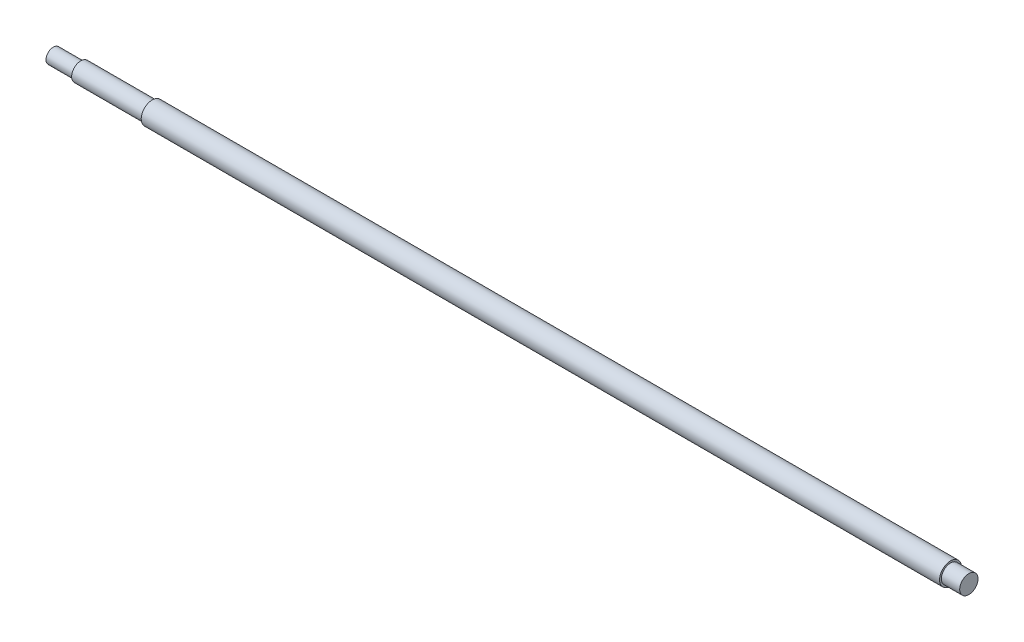
ISO-10303-21;
HEADER;
FILE_DESCRIPTION(('STEP AP214'),'2;1');
FILE_NAME('part.step','',(''),(''),'','','');
FILE_SCHEMA(('AUTOMOTIVE_DESIGN { 1 0 10303 214 1 1 1 1 }'));
ENDSEC;
DATA;
#1=APPLICATION_CONTEXT('core data for automotive mechanical design processes');
#2=APPLICATION_PROTOCOL_DEFINITION('international standard','automotive_design',2000,#1);
#3=PRODUCT_CONTEXT('',#1,'mechanical');
#4=PRODUCT('Part','Part','',(#3));
#5=PRODUCT_RELATED_PRODUCT_CATEGORY('part','',(#4));
#6=PRODUCT_DEFINITION_FORMATION('','',#4);
#7=PRODUCT_DEFINITION_CONTEXT('part definition',#1,'design');
#8=PRODUCT_DEFINITION('design','',#6,#7);
#9=PRODUCT_DEFINITION_SHAPE('','',#8);
#10=(LENGTH_UNIT() NAMED_UNIT(*) SI_UNIT(.MILLI.,.METRE.));
#11=(NAMED_UNIT(*) PLANE_ANGLE_UNIT() SI_UNIT($,.RADIAN.));
#12=(NAMED_UNIT(*) SI_UNIT($,.STERADIAN.) SOLID_ANGLE_UNIT());
#13=UNCERTAINTY_MEASURE_WITH_UNIT(LENGTH_MEASURE(1.E-05),#10,'distance_accuracy_value','');
#14=(GEOMETRIC_REPRESENTATION_CONTEXT(3) GLOBAL_UNCERTAINTY_ASSIGNED_CONTEXT((#13)) GLOBAL_UNIT_ASSIGNED_CONTEXT((#10,
#11,#12)) REPRESENTATION_CONTEXT('',''));
#15=CARTESIAN_POINT('',(0.,0.,0.));
#16=DIRECTION('',(0.,0.,1.));
#17=DIRECTION('',(1.,0.,0.));
#18=AXIS2_PLACEMENT_3D('',#15,#16,#17);
#19=CARTESIAN_POINT('',(0.,0.,0.));
#20=DIRECTION('',(1.,0.,0.));
#21=DIRECTION('',(0.,1.,0.));
#22=AXIS2_PLACEMENT_3D('',#19,#20,#21);
#23=PLANE('',#22);
#24=CARTESIAN_POINT('',(0.,0.,0.));
#25=DIRECTION('',(1.,0.,0.));
#26=DIRECTION('',(0.,1.,0.));
#27=AXIS2_PLACEMENT_3D('',#24,#25,#26);
#28=CIRCLE('',#27,5.);
#29=CARTESIAN_POINT('',(0.,5.,0.));
#30=VERTEX_POINT('',#29);
#31=EDGE_CURVE('E10',#30,#30,#28,.T.);
#32=ORIENTED_EDGE('',*,*,#31,.T.);
#33=EDGE_LOOP('',(#32));
#34=FACE_BOUND('',#33,.T.);
#35=ADVANCED_FACE('F33',(#34),#23,.T.);
#36=CARTESIAN_POINT('',(0.,0.,0.));
#37=DIRECTION('',(1.,0.,0.));
#38=DIRECTION('',(0.,1.,0.));
#39=AXIS2_PLACEMENT_3D('',#36,#37,#38);
#40=CYLINDRICAL_SURFACE('',#39,5.);
#41=CARTESIAN_POINT('',(-10.,0.,0.));
#42=DIRECTION('',(1.,0.,0.));
#43=DIRECTION('',(0.,1.,0.));
#44=AXIS2_PLACEMENT_3D('',#41,#42,#43);
#45=CIRCLE('',#44,5.);
#46=CARTESIAN_POINT('',(-10.,5.,0.));
#47=VERTEX_POINT('',#46);
#48=EDGE_CURVE('E39',#47,#47,#45,.T.);
#49=ORIENTED_EDGE('',*,*,#48,.T.);
#50=EDGE_LOOP('',(#49));
#51=FACE_BOUND('',#50,.T.);
#52=ORIENTED_EDGE('',*,*,#31,.F.);
#53=EDGE_LOOP('',(#52));
#54=FACE_BOUND('',#53,.T.);
#55=ADVANCED_FACE('F77',(#51,#54),#40,.T.);
#56=CARTESIAN_POINT('',(-10.,5.,0.));
#57=DIRECTION('',(1.,0.,0.));
#58=DIRECTION('',(0.,1.,0.));
#59=AXIS2_PLACEMENT_3D('',#56,#57,#58);
#60=PLANE('',#59);
#61=CARTESIAN_POINT('',(-10.,0.,0.));
#62=DIRECTION('',(1.,0.,0.));
#63=DIRECTION('',(0.,1.,0.));
#64=AXIS2_PLACEMENT_3D('',#61,#62,#63);
#65=CIRCLE('',#64,6.);
#66=CARTESIAN_POINT('',(-10.,6.,0.));
#67=VERTEX_POINT('',#66);
#68=EDGE_CURVE('E43',#67,#67,#65,.T.);
#69=ORIENTED_EDGE('',*,*,#68,.T.);
#70=EDGE_LOOP('',(#69));
#71=FACE_BOUND('',#70,.T.);
#72=ORIENTED_EDGE('',*,*,#48,.F.);
#73=EDGE_LOOP('',(#72));
#74=FACE_BOUND('',#73,.T.);
#75=ADVANCED_FACE('F81',(#71,#74),#60,.T.);
#76=CARTESIAN_POINT('',(0.,0.,0.));
#77=DIRECTION('',(1.,0.,0.));
#78=DIRECTION('',(0.,1.,0.));
#79=AXIS2_PLACEMENT_3D('',#76,#77,#78);
#80=CYLINDRICAL_SURFACE('',#79,6.);
#81=CARTESIAN_POINT('',(-446.,0.,0.));
#82=DIRECTION('',(1.,0.,0.));
#83=DIRECTION('',(0.,1.,0.));
#84=AXIS2_PLACEMENT_3D('',#81,#82,#83);
#85=CIRCLE('',#84,6.);
#86=CARTESIAN_POINT('',(-446.,5.99999999999994,0.));
#87=VERTEX_POINT('',#86);
#88=EDGE_CURVE('E47',#87,#87,#85,.T.);
#89=ORIENTED_EDGE('',*,*,#88,.T.);
#90=EDGE_LOOP('',(#89));
#91=FACE_BOUND('',#90,.T.);
#92=ORIENTED_EDGE('',*,*,#68,.F.);
#93=EDGE_LOOP('',(#92));
#94=FACE_BOUND('',#93,.T.);
#95=ADVANCED_FACE('F85',(#91,#94),#80,.T.);
#96=CARTESIAN_POINT('',(-446.,5.99999999999994,0.));
#97=DIRECTION('',(-1.,0.,0.));
#98=DIRECTION('',(0.,-1.,0.));
#99=AXIS2_PLACEMENT_3D('',#96,#97,#98);
#100=PLANE('',#99);
#101=CARTESIAN_POINT('',(-446.,0.,0.));
#102=DIRECTION('',(1.,0.,0.));
#103=DIRECTION('',(0.,1.,0.));
#104=AXIS2_PLACEMENT_3D('',#101,#102,#103);
#105=CIRCLE('',#104,5.);
#106=CARTESIAN_POINT('',(-446.,4.99999999999995,0.));
#107=VERTEX_POINT('',#106);
#108=EDGE_CURVE('E52',#107,#107,#105,.T.);
#109=ORIENTED_EDGE('',*,*,#108,.T.);
#110=EDGE_LOOP('',(#109));
#111=FACE_BOUND('',#110,.T.);
#112=ORIENTED_EDGE('',*,*,#88,.F.);
#113=EDGE_LOOP('',(#112));
#114=FACE_BOUND('',#113,.T.);
#115=ADVANCED_FACE('F92',(#111,#114),#100,.T.);
#116=CARTESIAN_POINT('',(0.,0.,0.));
#117=DIRECTION('',(1.,0.,0.));
#118=DIRECTION('',(0.,1.,0.));
#119=AXIS2_PLACEMENT_3D('',#116,#117,#118);
#120=CYLINDRICAL_SURFACE('',#119,5.);
#121=CARTESIAN_POINT('',(-485.,0.,0.));
#122=DIRECTION('',(1.,0.,0.));
#123=DIRECTION('',(0.,1.,0.));
#124=AXIS2_PLACEMENT_3D('',#121,#122,#123);
#125=CIRCLE('',#124,5.);
#126=CARTESIAN_POINT('',(-485.,4.99999999999994,0.));
#127=VERTEX_POINT('',#126);
#128=EDGE_CURVE('E55',#127,#127,#125,.T.);
#129=ORIENTED_EDGE('',*,*,#128,.T.);
#130=EDGE_LOOP('',(#129));
#131=FACE_BOUND('',#130,.T.);
#132=ORIENTED_EDGE('',*,*,#108,.F.);
#133=EDGE_LOOP('',(#132));
#134=FACE_BOUND('',#133,.T.);
#135=ADVANCED_FACE('F96',(#131,#134),#120,.T.);
#136=CARTESIAN_POINT('',(-485.,4.99999999999994,0.));
#137=DIRECTION('',(-1.,0.,0.));
#138=DIRECTION('',(0.,-1.,0.));
#139=AXIS2_PLACEMENT_3D('',#136,#137,#138);
#140=PLANE('',#139);
#141=CARTESIAN_POINT('',(-485.,0.,0.));
#142=DIRECTION('',(1.,0.,0.));
#143=DIRECTION('',(0.,1.,0.));
#144=AXIS2_PLACEMENT_3D('',#141,#142,#143);
#145=CIRCLE('',#144,4.);
#146=CARTESIAN_POINT('',(-485.,3.99999999999994,0.));
#147=VERTEX_POINT('',#146);
#148=EDGE_CURVE('E58',#147,#147,#145,.T.);
#149=ORIENTED_EDGE('',*,*,#148,.T.);
#150=EDGE_LOOP('',(#149));
#151=FACE_BOUND('',#150,.T.);
#152=ORIENTED_EDGE('',*,*,#128,.F.);
#153=EDGE_LOOP('',(#152));
#154=FACE_BOUND('',#153,.T.);
#155=ADVANCED_FACE('F74',(#151,#154),#140,.T.);
#156=CARTESIAN_POINT('',(0.,0.,0.));
#157=DIRECTION('',(1.,0.,0.));
#158=DIRECTION('',(0.,1.,0.));
#159=AXIS2_PLACEMENT_3D('',#156,#157,#158);
#160=CYLINDRICAL_SURFACE('',#159,4.);
#161=CARTESIAN_POINT('',(-500.,0.,0.));
#162=DIRECTION('',(1.,0.,0.));
#163=DIRECTION('',(0.,1.,0.));
#164=AXIS2_PLACEMENT_3D('',#161,#162,#163);
#165=CIRCLE('',#164,4.);
#166=CARTESIAN_POINT('',(-500.,3.99999999999994,0.));
#167=VERTEX_POINT('',#166);
#168=EDGE_CURVE('E61',#167,#167,#165,.T.);
#169=ORIENTED_EDGE('',*,*,#168,.T.);
#170=EDGE_LOOP('',(#169));
#171=FACE_BOUND('',#170,.T.);
#172=ORIENTED_EDGE('',*,*,#148,.F.);
#173=EDGE_LOOP('',(#172));
#174=FACE_BOUND('',#173,.T.);
#175=ADVANCED_FACE('F65',(#171,#174),#160,.T.);
#176=CARTESIAN_POINT('',(-500.,3.99999999999994,0.));
#177=DIRECTION('',(-1.,0.,0.));
#178=DIRECTION('',(0.,-1.,0.));
#179=AXIS2_PLACEMENT_3D('',#176,#177,#178);
#180=PLANE('',#179);
#181=ORIENTED_EDGE('',*,*,#168,.F.);
#182=EDGE_LOOP('',(#181));
#183=FACE_BOUND('',#182,.T.);
#184=ADVANCED_FACE('F68',(#183),#180,.T.);
#185=CLOSED_SHELL('',(#35,#55,#75,#95,#115,#135,#155,#175,#184));
#186=MANIFOLD_SOLID_BREP('B2',#185);
#187=ADVANCED_BREP_SHAPE_REPRESENTATION('',(#18,#186),#14);
#188=SHAPE_DEFINITION_REPRESENTATION(#9,#187);
ENDSEC;
END-ISO-10303-21;
